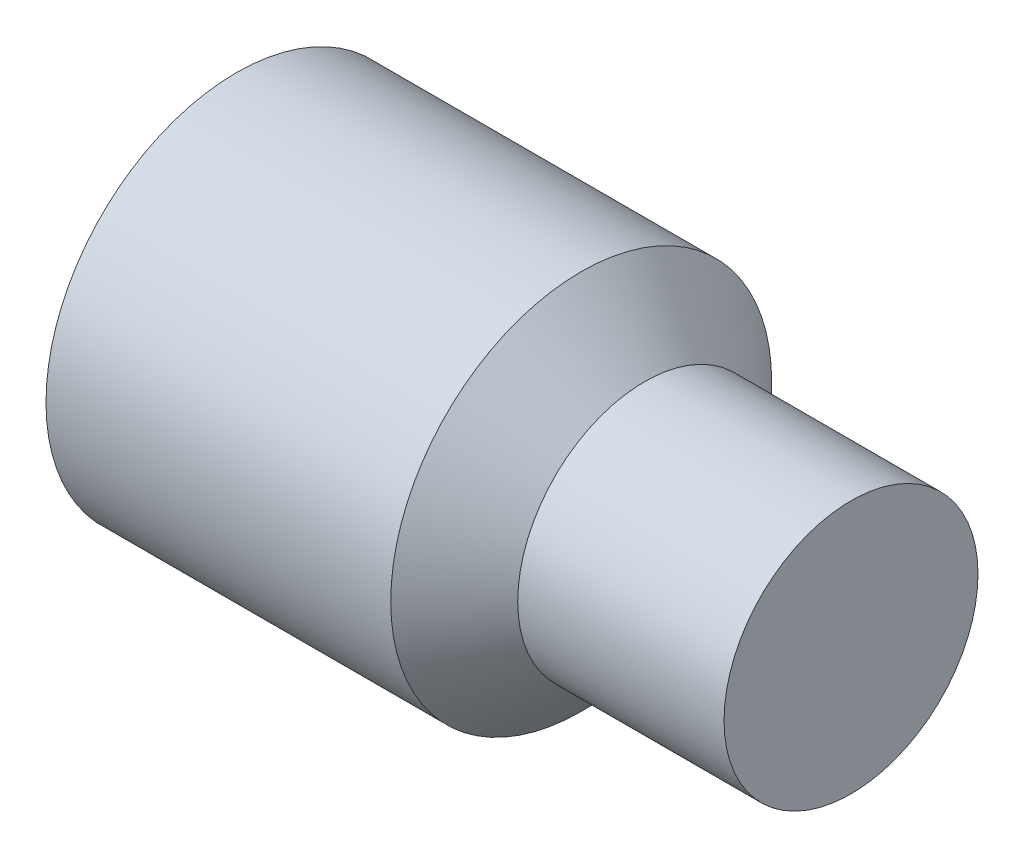
ISO-10303-21;
HEADER;
FILE_DESCRIPTION(('STEP AP214'),'2;1');
FILE_NAME('part.step','',(''),(''),'','','');
FILE_SCHEMA(('AUTOMOTIVE_DESIGN { 1 0 10303 214 1 1 1 1 }'));
ENDSEC;
DATA;
#1=APPLICATION_CONTEXT('core data for automotive mechanical design processes');
#2=APPLICATION_PROTOCOL_DEFINITION('international standard','automotive_design',2000,#1);
#3=PRODUCT_CONTEXT('',#1,'mechanical');
#4=PRODUCT('Part','Part','',(#3));
#5=PRODUCT_RELATED_PRODUCT_CATEGORY('part','',(#4));
#6=PRODUCT_DEFINITION_FORMATION('','',#4);
#7=PRODUCT_DEFINITION_CONTEXT('part definition',#1,'design');
#8=PRODUCT_DEFINITION('design','',#6,#7);
#9=PRODUCT_DEFINITION_SHAPE('','',#8);
#10=(LENGTH_UNIT() NAMED_UNIT(*) SI_UNIT(.MILLI.,.METRE.));
#11=(NAMED_UNIT(*) PLANE_ANGLE_UNIT() SI_UNIT($,.RADIAN.));
#12=(NAMED_UNIT(*) SI_UNIT($,.STERADIAN.) SOLID_ANGLE_UNIT());
#13=UNCERTAINTY_MEASURE_WITH_UNIT(LENGTH_MEASURE(1.E-05),#10,'distance_accuracy_value','');
#14=(GEOMETRIC_REPRESENTATION_CONTEXT(3) GLOBAL_UNCERTAINTY_ASSIGNED_CONTEXT((#13)) GLOBAL_UNIT_ASSIGNED_CONTEXT((#10,
#11,#12)) REPRESENTATION_CONTEXT('',''));
#15=CARTESIAN_POINT('',(0.,0.,0.));
#16=DIRECTION('',(0.,0.,1.));
#17=DIRECTION('',(1.,0.,0.));
#18=AXIS2_PLACEMENT_3D('',#15,#16,#17);
#19=CARTESIAN_POINT('',(0.,0.,0.));
#20=DIRECTION('',(-1.,0.,0.));
#21=DIRECTION('',(0.,0.,1.));
#22=AXIS2_PLACEMENT_3D('',#19,#20,#21);
#23=PLANE('',#22);
#24=CARTESIAN_POINT('',(0.,0.,0.));
#25=DIRECTION('',(-1.,0.,0.));
#26=DIRECTION('',(0.,0.,1.));
#27=AXIS2_PLACEMENT_3D('',#24,#25,#26);
#28=CIRCLE('',#27,2.4455);
#29=CARTESIAN_POINT('',(0.,0.,2.4455));
#30=VERTEX_POINT('',#29);
#31=EDGE_CURVE('E11',#30,#30,#28,.T.);
#32=ORIENTED_EDGE('',*,*,#31,.T.);
#33=EDGE_LOOP('',(#32));
#34=FACE_BOUND('',#33,.T.);
#35=DIRECTION('',(0.,0.,-1.));
#36=VECTOR('',#35,1.);
#37=CARTESIAN_POINT('',(0.,1.5,0.866025403784434));
#38=LINE('',#37,#36);
#39=CARTESIAN_POINT('',(0.,1.5,0.866025403784434));
#40=VERTEX_POINT('',#39);
#41=CARTESIAN_POINT('',(0.,1.5,-0.866025403784442));
#42=VERTEX_POINT('',#41);
#43=EDGE_CURVE('E127',#40,#42,#38,.T.);
#44=ORIENTED_EDGE('',*,*,#43,.F.);
#45=DIRECTION('',(0.,-0.866025403784439,0.5));
#46=VECTOR('',#45,1.);
#47=CARTESIAN_POINT('',(0.,1.5,0.866025403784434));
#48=LINE('',#47,#46);
#49=CARTESIAN_POINT('',(0.,0.,1.73205080756887));
#50=VERTEX_POINT('',#49);
#51=EDGE_CURVE('E49',#40,#50,#48,.T.);
#52=ORIENTED_EDGE('',*,*,#51,.T.);
#53=DIRECTION('',(0.,0.866025403784439,0.5));
#54=VECTOR('',#53,1.);
#55=CARTESIAN_POINT('',(0.,-1.49999999999999,0.866025403784435));
#56=LINE('',#55,#54);
#57=CARTESIAN_POINT('',(0.,-1.49999999999999,0.866025403784435));
#58=VERTEX_POINT('',#57);
#59=EDGE_CURVE('E118',#58,#50,#56,.T.);
#60=ORIENTED_EDGE('',*,*,#59,.F.);
#61=DIRECTION('',(0.,0.,-1.));
#62=VECTOR('',#61,1.);
#63=CARTESIAN_POINT('',(0.,-1.49999999999999,0.866025403784435));
#64=LINE('',#63,#62);
#65=CARTESIAN_POINT('',(0.,-1.49999999999999,-0.866025403784441));
#66=VERTEX_POINT('',#65);
#67=EDGE_CURVE('E121',#58,#66,#64,.T.);
#68=ORIENTED_EDGE('',*,*,#67,.T.);
#69=DIRECTION('',(0.,0.866025403784438,-0.500000000000001));
#70=VECTOR('',#69,1.);
#71=CARTESIAN_POINT('',(0.,-1.49999999999999,-0.866025403784441));
#72=LINE('',#71,#70);
#73=CARTESIAN_POINT('',(0.,0.,-1.73205080756888));
#74=VERTEX_POINT('',#73);
#75=EDGE_CURVE('E124',#66,#74,#72,.T.);
#76=ORIENTED_EDGE('',*,*,#75,.T.);
#77=DIRECTION('',(0.,-0.866025403784439,-0.5));
#78=VECTOR('',#77,1.);
#79=CARTESIAN_POINT('',(0.,1.5,-0.866025403784442));
#80=LINE('',#79,#78);
#81=EDGE_CURVE('E107',#42,#74,#80,.T.);
#82=ORIENTED_EDGE('',*,*,#81,.F.);
#83=EDGE_LOOP('',(#44,#52,#60,#68,#76,#82));
#84=FACE_BOUND('',#83,.T.);
#85=ADVANCED_FACE('F35',(#34,#84),#23,.T.);
#86=CARTESIAN_POINT('',(0.,0.,0.));
#87=DIRECTION('',(1.,0.,0.));
#88=DIRECTION('',(0.,0.,-1.));
#89=AXIS2_PLACEMENT_3D('',#86,#87,#88);
#90=CONICAL_SURFACE('',#89,2.4455,1.0471975511966);
#91=CARTESIAN_POINT('',(0.320140724265646,0.,0.));
#92=DIRECTION('',(-1.,0.,0.));
#93=DIRECTION('',(0.,0.,1.));
#94=AXIS2_PLACEMENT_3D('',#91,#92,#93);
#95=CIRCLE('',#94,3.);
#96=CARTESIAN_POINT('',(0.320140724265646,0.,3.));
#97=VERTEX_POINT('',#96);
#98=EDGE_CURVE('E42',#97,#97,#95,.T.);
#99=ORIENTED_EDGE('',*,*,#98,.T.);
#100=EDGE_LOOP('',(#99));
#101=FACE_BOUND('',#100,.T.);
#102=ORIENTED_EDGE('',*,*,#31,.F.);
#103=EDGE_LOOP('',(#102));
#104=FACE_BOUND('',#103,.T.);
#105=ADVANCED_FACE('F147',(#101,#104),#90,.T.);
#106=CARTESIAN_POINT('',(-12.7,0.,0.));
#107=DIRECTION('',(-1.,0.,0.));
#108=DIRECTION('',(0.,0.,1.));
#109=AXIS2_PLACEMENT_3D('',#106,#107,#108);
#110=CYLINDRICAL_SURFACE('',#109,3.);
#111=CARTESIAN_POINT('',(5.75000000000001,0.,0.));
#112=DIRECTION('',(-1.,0.,0.));
#113=DIRECTION('',(0.,0.,1.));
#114=AXIS2_PLACEMENT_3D('',#111,#112,#113);
#115=CIRCLE('',#114,3.);
#116=CARTESIAN_POINT('',(5.75000000000001,0.,3.));
#117=VERTEX_POINT('',#116);
#118=EDGE_CURVE('E142',#117,#117,#115,.T.);
#119=ORIENTED_EDGE('',*,*,#118,.T.);
#120=EDGE_LOOP('',(#119));
#121=FACE_BOUND('',#120,.T.);
#122=ORIENTED_EDGE('',*,*,#98,.F.);
#123=EDGE_LOOP('',(#122));
#124=FACE_BOUND('',#123,.T.);
#125=ADVANCED_FACE('F150',(#121,#124),#110,.T.);
#126=CARTESIAN_POINT('',(5.75000000000001,0.,0.));
#127=DIRECTION('',(-1.,0.,0.));
#128=DIRECTION('',(0.,0.,1.));
#129=AXIS2_PLACEMENT_3D('',#126,#127,#128);
#130=CONICAL_SURFACE('',#129,3.,0.785398163397451);
#131=CARTESIAN_POINT('',(6.75,0.,0.));
#132=DIRECTION('',(-1.,0.,0.));
#133=DIRECTION('',(0.,0.,1.));
#134=AXIS2_PLACEMENT_3D('',#131,#132,#133);
#135=CIRCLE('',#134,2.);
#136=CARTESIAN_POINT('',(6.75,0.,2.));
#137=VERTEX_POINT('',#136);
#138=EDGE_CURVE('E139',#137,#137,#135,.T.);
#139=ORIENTED_EDGE('',*,*,#138,.T.);
#140=EDGE_LOOP('',(#139));
#141=FACE_BOUND('',#140,.T.);
#142=ORIENTED_EDGE('',*,*,#118,.F.);
#143=EDGE_LOOP('',(#142));
#144=FACE_BOUND('',#143,.T.);
#145=ADVANCED_FACE('F152',(#141,#144),#130,.T.);
#146=CARTESIAN_POINT('',(-12.7,0.,0.));
#147=DIRECTION('',(-1.,0.,0.));
#148=DIRECTION('',(0.,0.,1.));
#149=AXIS2_PLACEMENT_3D('',#146,#147,#148);
#150=CYLINDRICAL_SURFACE('',#149,2.);
#151=CARTESIAN_POINT('',(10.,0.,0.));
#152=DIRECTION('',(-1.,0.,0.));
#153=DIRECTION('',(0.,0.,1.));
#154=AXIS2_PLACEMENT_3D('',#151,#152,#153);
#155=CIRCLE('',#154,2.);
#156=CARTESIAN_POINT('',(10.,0.,2.));
#157=VERTEX_POINT('',#156);
#158=EDGE_CURVE('E136',#157,#157,#155,.T.);
#159=ORIENTED_EDGE('',*,*,#158,.T.);
#160=EDGE_LOOP('',(#159));
#161=FACE_BOUND('',#160,.T.);
#162=ORIENTED_EDGE('',*,*,#138,.F.);
#163=EDGE_LOOP('',(#162));
#164=FACE_BOUND('',#163,.T.);
#165=ADVANCED_FACE('F159',(#161,#164),#150,.T.);
#166=CARTESIAN_POINT('',(10.,2.,0.));
#167=DIRECTION('',(1.,0.,0.));
#168=DIRECTION('',(0.,0.,-1.));
#169=AXIS2_PLACEMENT_3D('',#166,#167,#168);
#170=PLANE('',#169);
#171=ORIENTED_EDGE('',*,*,#158,.F.);
#172=EDGE_LOOP('',(#171));
#173=FACE_BOUND('',#172,.T.);
#174=ADVANCED_FACE('F194',(#173),#170,.T.);
#175=CARTESIAN_POINT('',(3.5,1.5,0.866025403784434));
#176=DIRECTION('',(0.,-0.5,-0.866025403784438));
#177=DIRECTION('',(0.,0.866025403784438,-0.5));
#178=AXIS2_PLACEMENT_3D('',#175,#176,#177);
#179=PLANE('',#178);
#180=ORIENTED_EDGE('',*,*,#51,.F.);
#181=DIRECTION('',(-1.,0.,0.));
#182=VECTOR('',#181,1.);
#183=CARTESIAN_POINT('',(3.5,1.5,0.866025403784434));
#184=LINE('',#183,#182);
#185=CARTESIAN_POINT('',(3.5,1.5,0.866025403784434));
#186=VERTEX_POINT('',#185);
#187=EDGE_CURVE('E54',#186,#40,#184,.T.);
#188=ORIENTED_EDGE('',*,*,#187,.F.);
#189=DIRECTION('',(0.,-0.866025403784439,0.5));
#190=VECTOR('',#189,1.);
#191=CARTESIAN_POINT('',(3.5,1.5,0.866025403784434));
#192=LINE('',#191,#190);
#193=CARTESIAN_POINT('',(3.5,0.,1.73205080756887));
#194=VERTEX_POINT('',#193);
#195=EDGE_CURVE('E81',#186,#194,#192,.T.);
#196=ORIENTED_EDGE('',*,*,#195,.T.);
#197=DIRECTION('',(-1.,0.,0.));
#198=VECTOR('',#197,1.);
#199=CARTESIAN_POINT('',(3.5,0.,1.73205080756887));
#200=LINE('',#199,#198);
#201=EDGE_CURVE('E134',#194,#50,#200,.T.);
#202=ORIENTED_EDGE('',*,*,#201,.T.);
#203=EDGE_LOOP('',(#180,#188,#196,#202));
#204=FACE_BOUND('',#203,.T.);
#205=ADVANCED_FACE('F190',(#204),#179,.T.);
#206=CARTESIAN_POINT('',(3.5,-1.49999999999999,0.866025403784435));
#207=DIRECTION('',(0.,-0.5,0.866025403784439));
#208=DIRECTION('',(0.,-0.866025403784439,-0.5));
#209=AXIS2_PLACEMENT_3D('',#206,#207,#208);
#210=PLANE('',#209);
#211=ORIENTED_EDGE('',*,*,#59,.T.);
#212=ORIENTED_EDGE('',*,*,#201,.F.);
#213=DIRECTION('',(0.,0.866025403784439,0.5));
#214=VECTOR('',#213,1.);
#215=CARTESIAN_POINT('',(3.5,-1.49999999999999,0.866025403784435));
#216=LINE('',#215,#214);
#217=CARTESIAN_POINT('',(3.5,-1.49999999999999,0.866025403784435));
#218=VERTEX_POINT('',#217);
#219=EDGE_CURVE('E282',#218,#194,#216,.T.);
#220=ORIENTED_EDGE('',*,*,#219,.F.);
#221=DIRECTION('',(-1.,0.,0.));
#222=VECTOR('',#221,1.);
#223=CARTESIAN_POINT('',(3.5,-1.49999999999999,0.866025403784435));
#224=LINE('',#223,#222);
#225=EDGE_CURVE('E132',#218,#58,#224,.T.);
#226=ORIENTED_EDGE('',*,*,#225,.T.);
#227=EDGE_LOOP('',(#211,#212,#220,#226));
#228=FACE_BOUND('',#227,.T.);
#229=ADVANCED_FACE('F186',(#228),#210,.F.);
#230=CARTESIAN_POINT('',(3.5,-1.49999999999999,0.866025403784435));
#231=DIRECTION('',(0.,1.,0.));
#232=DIRECTION('',(0.,0.,1.));
#233=AXIS2_PLACEMENT_3D('',#230,#231,#232);
#234=PLANE('',#233);
#235=ORIENTED_EDGE('',*,*,#67,.F.);
#236=ORIENTED_EDGE('',*,*,#225,.F.);
#237=DIRECTION('',(0.,0.,-1.));
#238=VECTOR('',#237,1.);
#239=CARTESIAN_POINT('',(3.5,-1.49999999999999,0.866025403784435));
#240=LINE('',#239,#238);
#241=CARTESIAN_POINT('',(3.5,-1.49999999999999,-0.866025403784441));
#242=VERTEX_POINT('',#241);
#243=EDGE_CURVE('E102',#218,#242,#240,.T.);
#244=ORIENTED_EDGE('',*,*,#243,.T.);
#245=DIRECTION('',(-1.,0.,0.));
#246=VECTOR('',#245,1.);
#247=CARTESIAN_POINT('',(3.5,-1.49999999999999,-0.866025403784441));
#248=LINE('',#247,#246);
#249=EDGE_CURVE('E97',#242,#66,#248,.T.);
#250=ORIENTED_EDGE('',*,*,#249,.T.);
#251=EDGE_LOOP('',(#235,#236,#244,#250));
#252=FACE_BOUND('',#251,.T.);
#253=ADVANCED_FACE('F183',(#252),#234,.T.);
#254=CARTESIAN_POINT('',(3.5,-1.49999999999999,-0.866025403784441));
#255=DIRECTION('',(0.,0.500000000000001,0.866025403784438));
#256=DIRECTION('',(0.,-0.866025403784438,0.500000000000001));
#257=AXIS2_PLACEMENT_3D('',#254,#255,#256);
#258=PLANE('',#257);
#259=ORIENTED_EDGE('',*,*,#75,.F.);
#260=ORIENTED_EDGE('',*,*,#249,.F.);
#261=DIRECTION('',(0.,0.866025403784438,-0.500000000000001));
#262=VECTOR('',#261,1.);
#263=CARTESIAN_POINT('',(3.5,-1.49999999999999,-0.866025403784441));
#264=LINE('',#263,#262);
#265=CARTESIAN_POINT('',(3.5,0.,-1.73205080756888));
#266=VERTEX_POINT('',#265);
#267=EDGE_CURVE('E92',#242,#266,#264,.T.);
#268=ORIENTED_EDGE('',*,*,#267,.T.);
#269=DIRECTION('',(-1.,0.,0.));
#270=VECTOR('',#269,1.);
#271=CARTESIAN_POINT('',(3.5,0.,-1.73205080756888));
#272=LINE('',#271,#270);
#273=EDGE_CURVE('E96',#266,#74,#272,.T.);
#274=ORIENTED_EDGE('',*,*,#273,.T.);
#275=EDGE_LOOP('',(#259,#260,#268,#274));
#276=FACE_BOUND('',#275,.T.);
#277=ADVANCED_FACE('F95',(#276),#258,.T.);
#278=CARTESIAN_POINT('',(3.5,1.5,-0.866025403784442));
#279=DIRECTION('',(0.,0.5,-0.866025403784439));
#280=DIRECTION('',(0.,0.866025403784439,0.5));
#281=AXIS2_PLACEMENT_3D('',#278,#279,#280);
#282=PLANE('',#281);
#283=ORIENTED_EDGE('',*,*,#81,.T.);
#284=ORIENTED_EDGE('',*,*,#273,.F.);
#285=DIRECTION('',(0.,-0.866025403784439,-0.5));
#286=VECTOR('',#285,1.);
#287=CARTESIAN_POINT('',(3.5,1.5,-0.866025403784442));
#288=LINE('',#287,#286);
#289=CARTESIAN_POINT('',(3.5,1.5,-0.866025403784442));
#290=VERTEX_POINT('',#289);
#291=EDGE_CURVE('E101',#290,#266,#288,.T.);
#292=ORIENTED_EDGE('',*,*,#291,.F.);
#293=DIRECTION('',(-1.,0.,0.));
#294=VECTOR('',#293,1.);
#295=CARTESIAN_POINT('',(3.5,1.5,-0.866025403784442));
#296=LINE('',#295,#294);
#297=EDGE_CURVE('E77',#290,#42,#296,.T.);
#298=ORIENTED_EDGE('',*,*,#297,.T.);
#299=EDGE_LOOP('',(#283,#284,#292,#298));
#300=FACE_BOUND('',#299,.T.);
#301=ADVANCED_FACE('F104',(#300),#282,.F.);
#302=CARTESIAN_POINT('',(3.5,1.5,0.866025403784434));
#303=DIRECTION('',(0.,1.,0.));
#304=DIRECTION('',(0.,0.,1.));
#305=AXIS2_PLACEMENT_3D('',#302,#303,#304);
#306=PLANE('',#305);
#307=ORIENTED_EDGE('',*,*,#43,.T.);
#308=ORIENTED_EDGE('',*,*,#297,.F.);
#309=DIRECTION('',(0.,0.,-1.));
#310=VECTOR('',#309,1.);
#311=CARTESIAN_POINT('',(3.5,1.5,0.866025403784434));
#312=LINE('',#311,#310);
#313=EDGE_CURVE('E112',#186,#290,#312,.T.);
#314=ORIENTED_EDGE('',*,*,#313,.F.);
#315=ORIENTED_EDGE('',*,*,#187,.T.);
#316=EDGE_LOOP('',(#307,#308,#314,#315));
#317=FACE_BOUND('',#316,.T.);
#318=ADVANCED_FACE('F171',(#317),#306,.F.);
#319=CARTESIAN_POINT('',(3.5,3.,0.));
#320=DIRECTION('',(1.,0.,0.));
#321=DIRECTION('',(0.,0.,-1.));
#322=AXIS2_PLACEMENT_3D('',#319,#320,#321);
#323=PLANE('',#322);
#324=ORIENTED_EDGE('',*,*,#195,.F.);
#325=ORIENTED_EDGE('',*,*,#313,.T.);
#326=ORIENTED_EDGE('',*,*,#291,.T.);
#327=ORIENTED_EDGE('',*,*,#267,.F.);
#328=ORIENTED_EDGE('',*,*,#243,.F.);
#329=ORIENTED_EDGE('',*,*,#219,.T.);
#330=EDGE_LOOP('',(#324,#325,#326,#327,#328,#329));
#331=FACE_BOUND('',#330,.T.);
#332=ADVANCED_FACE('F110',(#331),#323,.F.);
#333=CLOSED_SHELL('',(#85,#105,#125,#145,#165,#174,#205,#229,#253,#277,#301,#318,#332));
#334=MANIFOLD_SOLID_BREP('B2',#333);
#335=ADVANCED_BREP_SHAPE_REPRESENTATION('',(#18,#334),#14);
#336=SHAPE_DEFINITION_REPRESENTATION(#9,#335);
ENDSEC;
END-ISO-10303-21;
